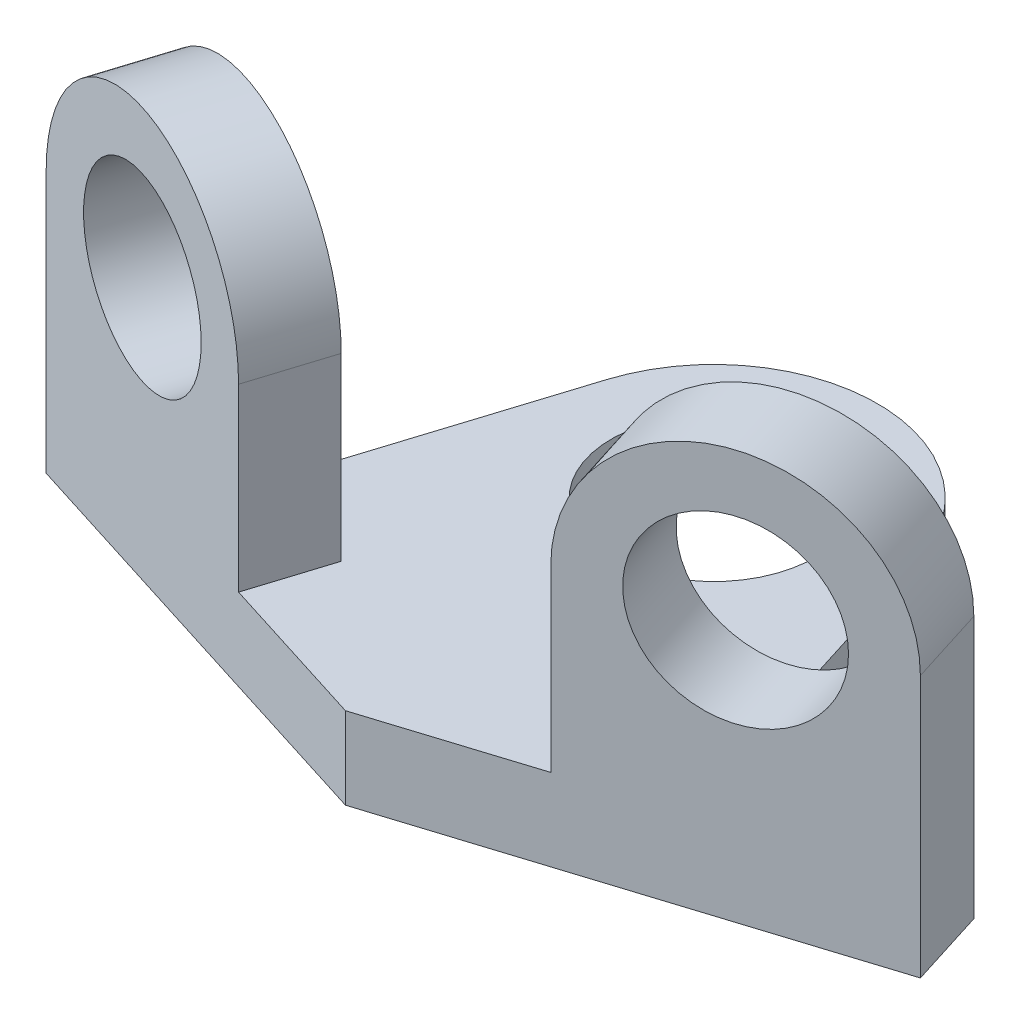
ISO-10303-21;
HEADER;
FILE_DESCRIPTION(('STEP AP214'),'2;1');
FILE_NAME('part.step','',(''),(''),'','','');
FILE_SCHEMA(('AUTOMOTIVE_DESIGN { 1 0 10303 214 1 1 1 1 }'));
ENDSEC;
DATA;
#1=APPLICATION_CONTEXT('core data for automotive mechanical design processes');
#2=APPLICATION_PROTOCOL_DEFINITION('international standard','automotive_design',2000,#1);
#3=PRODUCT_CONTEXT('',#1,'mechanical');
#4=PRODUCT('Part','Part','',(#3));
#5=PRODUCT_RELATED_PRODUCT_CATEGORY('part','',(#4));
#6=PRODUCT_DEFINITION_FORMATION('','',#4);
#7=PRODUCT_DEFINITION_CONTEXT('part definition',#1,'design');
#8=PRODUCT_DEFINITION('design','',#6,#7);
#9=PRODUCT_DEFINITION_SHAPE('','',#8);
#10=(LENGTH_UNIT() NAMED_UNIT(*) SI_UNIT(.MILLI.,.METRE.));
#11=(NAMED_UNIT(*) PLANE_ANGLE_UNIT() SI_UNIT($,.RADIAN.));
#12=(NAMED_UNIT(*) SI_UNIT($,.STERADIAN.) SOLID_ANGLE_UNIT());
#13=UNCERTAINTY_MEASURE_WITH_UNIT(LENGTH_MEASURE(1.E-05),#10,'distance_accuracy_value','');
#14=(GEOMETRIC_REPRESENTATION_CONTEXT(3) GLOBAL_UNCERTAINTY_ASSIGNED_CONTEXT((#13)) GLOBAL_UNIT_ASSIGNED_CONTEXT((#10,
#11,#12)) REPRESENTATION_CONTEXT('',''));
#15=CARTESIAN_POINT('',(0.,0.,0.));
#16=DIRECTION('',(0.,0.,1.));
#17=DIRECTION('',(1.,0.,0.));
#18=AXIS2_PLACEMENT_3D('',#15,#16,#17);
#19=CARTESIAN_POINT('',(31.979808832863,10.,-10.083194993583));
#20=DIRECTION('',(-0.953716950748228,0.,0.300705799504271));
#21=DIRECTION('',(0.300705799504271,0.,0.953716950748228));
#22=AXIS2_PLACEMENT_3D('',#19,#20,#21);
#23=PLANE('',#22);
#24=DIRECTION('',(0.,1.,0.));
#25=VECTOR('',#24,1.);
#26=CARTESIAN_POINT('',(28.9727508378203,10.,-19.6203645010653));
#27=LINE('',#26,#25);
#28=CARTESIAN_POINT('',(28.9727508378203,0.,-19.6203645010653));
#29=VERTEX_POINT('',#28);
#30=CARTESIAN_POINT('',(28.9727508378203,10.,-19.6203645010653));
#31=VERTEX_POINT('',#30);
#32=EDGE_CURVE('E52',#29,#31,#27,.T.);
#33=ORIENTED_EDGE('',*,*,#32,.F.);
#34=DIRECTION('',(-0.300705799504271,0.,-0.953716950748228));
#35=VECTOR('',#34,1.);
#36=CARTESIAN_POINT('',(31.979808832863,0.,-10.083194993583));
#37=LINE('',#36,#35);
#38=CARTESIAN_POINT('',(19.0743390149646,0.,-51.0141159900854));
#39=VERTEX_POINT('',#38);
#40=EDGE_CURVE('E275',#29,#39,#37,.T.);
#41=ORIENTED_EDGE('',*,*,#40,.T.);
#42=DIRECTION('',(0.,-1.,0.));
#43=VECTOR('',#42,1.);
#44=CARTESIAN_POINT('',(19.0743390149646,10.,-51.0141159900854));
#45=LINE('',#44,#43);
#46=CARTESIAN_POINT('',(19.0743390149646,10.,-51.0141159900854));
#47=VERTEX_POINT('',#46);
#48=EDGE_CURVE('E287',#47,#39,#45,.T.);
#49=ORIENTED_EDGE('',*,*,#48,.F.);
#50=DIRECTION('',(-0.300705799504271,0.,-0.953716950748228));
#51=VECTOR('',#50,1.);
#52=CARTESIAN_POINT('',(31.979808832863,10.,-10.083194993583));
#53=LINE('',#52,#51);
#54=EDGE_CURVE('E259',#31,#47,#53,.T.);
#55=ORIENTED_EDGE('',*,*,#54,.F.);
#56=EDGE_LOOP('',(#33,#41,#49,#55));
#57=FACE_BOUND('',#56,.T.);
#58=ADVANCED_FACE('F43',(#57),#23,.F.);
#59=CARTESIAN_POINT('',(0.,10.,-45.));
#60=DIRECTION('',(0.,1.,0.));
#61=DIRECTION('',(0.,0.,1.));
#62=AXIS2_PLACEMENT_3D('',#59,#60,#61);
#63=PLANE('',#62);
#64=DIRECTION('',(0.30070579950427,0.,-0.953716950748228));
#65=VECTOR('',#64,1.);
#66=CARTESIAN_POINT('',(-6.16886919706613,10.,-46.9450369865878));
#67=LINE('',#66,#65);
#68=CARTESIAN_POINT('',(-19.0743390149646,10.,-6.01411599008541));
#69=VERTEX_POINT('',#68);
#70=CARTESIAN_POINT('',(-16.0672810199219,10.,-15.5512854975677));
#71=VERTEX_POINT('',#70);
#72=EDGE_CURVE('E143',#69,#71,#67,.T.);
#73=ORIENTED_EDGE('',*,*,#72,.F.);
#74=DIRECTION('',(0.953716950748228,0.,0.30070579950427));
#75=VECTOR('',#74,1.);
#76=CARTESIAN_POINT('',(-31.979808832863,10.,-10.083194993583));
#77=LINE('',#76,#75);
#78=CARTESIAN_POINT('',(0.,10.,0.));
#79=VERTEX_POINT('',#78);
#80=EDGE_CURVE('E253',#69,#79,#77,.T.);
#81=ORIENTED_EDGE('',*,*,#80,.T.);
#82=DIRECTION('',(0.953716950748228,0.,-0.300705799504271));
#83=VECTOR('',#82,1.);
#84=CARTESIAN_POINT('',(0.,10.,0.));
#85=LINE('',#84,#83);
#86=CARTESIAN_POINT('',(19.0743390149646,10.,-6.01411599008542));
#87=VERTEX_POINT('',#86);
#88=EDGE_CURVE('E64',#79,#87,#85,.T.);
#89=ORIENTED_EDGE('',*,*,#88,.T.);
#90=DIRECTION('',(0.300705799504271,0.,0.953716950748228));
#91=VECTOR('',#90,1.);
#92=CARTESIAN_POINT('',(6.1688691970661,10.,-46.9450369865878));
#93=LINE('',#92,#91);
#94=CARTESIAN_POINT('',(16.0672810199218,10.,-15.5512854975677));
#95=VERTEX_POINT('',#94);
#96=EDGE_CURVE('E59',#95,#87,#93,.T.);
#97=ORIENTED_EDGE('',*,*,#96,.F.);
#98=DIRECTION('',(0.953716950748228,0.,-0.300705799504271));
#99=VECTOR('',#98,1.);
#100=CARTESIAN_POINT('',(9.89841182285574,10.,-13.6062485109799));
#101=LINE('',#100,#99);
#102=EDGE_CURVE('E233',#95,#31,#101,.T.);
#103=ORIENTED_EDGE('',*,*,#102,.T.);
#104=ORIENTED_EDGE('',*,*,#54,.T.);
#105=CARTESIAN_POINT('',(0.,10.,-45.));
#106=DIRECTION('',(0.,1.,0.));
#107=DIRECTION('',(0.,0.,1.));
#108=AXIS2_PLACEMENT_3D('',#105,#106,#107);
#109=CIRCLE('',#108,20.);
#110=CARTESIAN_POINT('',(-19.0743390149646,10.,-51.0141159900854));
#111=VERTEX_POINT('',#110);
#112=EDGE_CURVE('E262',#47,#111,#109,.T.);
#113=ORIENTED_EDGE('',*,*,#112,.T.);
#114=DIRECTION('',(-0.30070579950427,0.,0.953716950748228));
#115=VECTOR('',#114,1.);
#116=CARTESIAN_POINT('',(-19.0743390149646,10.,-51.0141159900854));
#117=LINE('',#116,#115);
#118=CARTESIAN_POINT('',(-28.9727508378203,10.,-19.6203645010653));
#119=VERTEX_POINT('',#118);
#120=EDGE_CURVE('E265',#111,#119,#117,.T.);
#121=ORIENTED_EDGE('',*,*,#120,.T.);
#122=DIRECTION('',(-0.953716950748228,0.,-0.30070579950427));
#123=VECTOR('',#122,1.);
#124=CARTESIAN_POINT('',(-9.89841182285573,10.,-13.6062485109799));
#125=LINE('',#124,#123);
#126=EDGE_CURVE('E187',#71,#119,#125,.T.);
#127=ORIENTED_EDGE('',*,*,#126,.F.);
#128=EDGE_LOOP('',(#73,#81,#89,#97,#103,#104,#113,#121,#127));
#129=FACE_BOUND('',#128,.T.);
#130=CARTESIAN_POINT('',(0.,10.,-45.));
#131=DIRECTION('',(0.,1.,0.));
#132=DIRECTION('',(0.,0.,1.));
#133=AXIS2_PLACEMENT_3D('',#130,#131,#132);
#134=CIRCLE('',#133,12.5);
#135=CARTESIAN_POINT('',(0.,10.,-32.5));
#136=VERTEX_POINT('',#135);
#137=EDGE_CURVE('E245',#136,#136,#134,.T.);
#138=ORIENTED_EDGE('',*,*,#137,.F.);
#139=EDGE_LOOP('',(#138));
#140=FACE_BOUND('',#139,.T.);
#141=ADVANCED_FACE('F320',(#129,#140),#63,.T.);
#142=CARTESIAN_POINT('',(0.,0.,-45.));
#143=DIRECTION('',(0.,1.,0.));
#144=DIRECTION('',(0.,0.,1.));
#145=AXIS2_PLACEMENT_3D('',#142,#143,#144);
#146=PLANE('',#145);
#147=DIRECTION('',(0.953716950748228,0.,-0.300705799504271));
#148=VECTOR('',#147,1.);
#149=CARTESIAN_POINT('',(0.,0.,0.));
#150=LINE('',#149,#148);
#151=CARTESIAN_POINT('',(0.,0.,0.));
#152=VERTEX_POINT('',#151);
#153=CARTESIAN_POINT('',(53.4081492419007,0.,-16.8395247722392));
#154=VERTEX_POINT('',#153);
#155=EDGE_CURVE('E272',#152,#154,#150,.T.);
#156=ORIENTED_EDGE('',*,*,#155,.F.);
#157=DIRECTION('',(0.953716950748228,0.,0.30070579950427));
#158=VECTOR('',#157,1.);
#159=CARTESIAN_POINT('',(-31.979808832863,0.,-10.083194993583));
#160=LINE('',#159,#158);
#161=CARTESIAN_POINT('',(-53.4081492419008,0.,-16.8395247722391));
#162=VERTEX_POINT('',#161);
#163=EDGE_CURVE('E249',#162,#152,#160,.T.);
#164=ORIENTED_EDGE('',*,*,#163,.F.);
#165=DIRECTION('',(-0.30070579950427,0.,0.953716950748228));
#166=VECTOR('',#165,1.);
#167=CARTESIAN_POINT('',(-50.4010912468581,0.,-26.3766942797214));
#168=LINE('',#167,#166);
#169=CARTESIAN_POINT('',(-50.4010912468581,0.,-26.3766942797214));
#170=VERTEX_POINT('',#169);
#171=EDGE_CURVE('E183',#170,#162,#168,.T.);
#172=ORIENTED_EDGE('',*,*,#171,.F.);
#173=DIRECTION('',(0.953716950748228,0.,0.30070579950427));
#174=VECTOR('',#173,1.);
#175=CARTESIAN_POINT('',(-16.0672810199219,0.,-15.5512854975677));
#176=LINE('',#175,#174);
#177=CARTESIAN_POINT('',(-28.9727508378203,0.,-19.6203645010653));
#178=VERTEX_POINT('',#177);
#179=EDGE_CURVE('E158',#170,#178,#176,.T.);
#180=ORIENTED_EDGE('',*,*,#179,.T.);
#181=DIRECTION('',(-0.30070579950427,0.,0.953716950748228));
#182=VECTOR('',#181,1.);
#183=CARTESIAN_POINT('',(-19.0743390149646,0.,-51.0141159900854));
#184=LINE('',#183,#182);
#185=CARTESIAN_POINT('',(-19.0743390149646,0.,-51.0141159900854));
#186=VERTEX_POINT('',#185);
#187=EDGE_CURVE('E256',#186,#178,#184,.T.);
#188=ORIENTED_EDGE('',*,*,#187,.F.);
#189=CARTESIAN_POINT('',(0.,0.,-45.));
#190=DIRECTION('',(0.,1.,0.));
#191=DIRECTION('',(0.,0.,1.));
#192=AXIS2_PLACEMENT_3D('',#189,#190,#191);
#193=CIRCLE('',#192,20.);
#194=EDGE_CURVE('E278',#39,#186,#193,.T.);
#195=ORIENTED_EDGE('',*,*,#194,.F.);
#196=ORIENTED_EDGE('',*,*,#40,.F.);
#197=DIRECTION('',(0.953716950748228,0.,-0.300705799504271));
#198=VECTOR('',#197,1.);
#199=CARTESIAN_POINT('',(16.0672810199218,0.,-15.5512854975677));
#200=LINE('',#199,#198);
#201=CARTESIAN_POINT('',(50.401091246858,0.,-26.3766942797214));
#202=VERTEX_POINT('',#201);
#203=EDGE_CURVE('E207',#29,#202,#200,.T.);
#204=ORIENTED_EDGE('',*,*,#203,.T.);
#205=DIRECTION('',(0.300705799504271,0.,0.953716950748228));
#206=VECTOR('',#205,1.);
#207=CARTESIAN_POINT('',(50.401091246858,0.,-26.3766942797214));
#208=LINE('',#207,#206);
#209=EDGE_CURVE('E219',#202,#154,#208,.T.);
#210=ORIENTED_EDGE('',*,*,#209,.T.);
#211=EDGE_LOOP('',(#156,#164,#172,#180,#188,#195,#196,#204,#210));
#212=FACE_BOUND('',#211,.T.);
#213=CARTESIAN_POINT('',(0.,0.,-45.));
#214=DIRECTION('',(0.,1.,0.));
#215=DIRECTION('',(0.,0.,1.));
#216=AXIS2_PLACEMENT_3D('',#213,#214,#215);
#217=CIRCLE('',#216,12.5);
#218=CARTESIAN_POINT('',(0.,0.,-32.5));
#219=VERTEX_POINT('',#218);
#220=EDGE_CURVE('E244',#219,#219,#217,.T.);
#221=ORIENTED_EDGE('',*,*,#220,.T.);
#222=EDGE_LOOP('',(#221));
#223=FACE_BOUND('',#222,.T.);
#224=ADVANCED_FACE('F309',(#212,#223),#146,.F.);
#225=CARTESIAN_POINT('',(-31.979808832863,10.,-10.083194993583));
#226=DIRECTION('',(0.30070579950427,0.,-0.953716950748228));
#227=DIRECTION('',(-0.953716950748228,0.,-0.30070579950427));
#228=AXIS2_PLACEMENT_3D('',#225,#226,#227);
#229=PLANE('',#228);
#230=ORIENTED_EDGE('',*,*,#80,.F.);
#231=DIRECTION('',(0.,1.,0.));
#232=VECTOR('',#231,1.);
#233=CARTESIAN_POINT('',(-19.0743390149646,32.,-6.01411599008541));
#234=LINE('',#233,#232);
#235=CARTESIAN_POINT('',(-19.0743390149646,32.,-6.01411599008541));
#236=VERTEX_POINT('',#235);
#237=EDGE_CURVE('E174',#69,#236,#234,.T.);
#238=ORIENTED_EDGE('',*,*,#237,.T.);
#239=CARTESIAN_POINT('',(-36.2412441284327,32.,-11.4268203811623));
#240=DIRECTION('',(-0.30070579950427,0.,0.953716950748228));
#241=DIRECTION('',(-0.953716950748228,0.,-0.30070579950427));
#242=AXIS2_PLACEMENT_3D('',#239,#240,#241);
#243=CIRCLE('',#242,18.);
#244=CARTESIAN_POINT('',(-53.4081492419008,32.,-16.8395247722391));
#245=VERTEX_POINT('',#244);
#246=EDGE_CURVE('E155',#236,#245,#243,.T.);
#247=ORIENTED_EDGE('',*,*,#246,.T.);
#248=DIRECTION('',(0.,-1.,0.));
#249=VECTOR('',#248,1.);
#250=CARTESIAN_POINT('',(-53.4081492419008,0.,-16.8395247722391));
#251=LINE('',#250,#249);
#252=EDGE_CURVE('E149',#245,#162,#251,.T.);
#253=ORIENTED_EDGE('',*,*,#252,.T.);
#254=ORIENTED_EDGE('',*,*,#163,.T.);
#255=DIRECTION('',(0.,-1.,0.));
#256=VECTOR('',#255,1.);
#257=CARTESIAN_POINT('',(0.,10.,0.));
#258=LINE('',#257,#256);
#259=EDGE_CURVE('E291',#79,#152,#258,.T.);
#260=ORIENTED_EDGE('',*,*,#259,.F.);
#261=EDGE_LOOP('',(#230,#238,#247,#253,#254,#260));
#262=FACE_BOUND('',#261,.T.);
#263=CARTESIAN_POINT('',(-36.2412441284327,32.,-11.4268203811623));
#264=DIRECTION('',(-0.30070579950427,0.,0.953716950748228));
#265=DIRECTION('',(0.953716950748228,0.,0.30070579950427));
#266=AXIS2_PLACEMENT_3D('',#263,#264,#265);
#267=CIRCLE('',#266,11.);
#268=CARTESIAN_POINT('',(-25.7503576702022,32.,-8.1190565866153));
#269=VERTEX_POINT('',#268);
#270=EDGE_CURVE('E547',#269,#269,#267,.T.);
#271=ORIENTED_EDGE('',*,*,#270,.F.);
#272=EDGE_LOOP('',(#271));
#273=FACE_BOUND('',#272,.T.);
#274=ADVANCED_FACE('F45',(#262,#273),#229,.F.);
#275=CARTESIAN_POINT('',(0.,10.,0.));
#276=DIRECTION('',(-0.300705799504271,0.,-0.953716950748228));
#277=DIRECTION('',(-0.953716950748228,0.,0.300705799504271));
#278=AXIS2_PLACEMENT_3D('',#275,#276,#277);
#279=PLANE('',#278);
#280=ORIENTED_EDGE('',*,*,#155,.T.);
#281=DIRECTION('',(0.,1.,0.));
#282=VECTOR('',#281,1.);
#283=CARTESIAN_POINT('',(53.4081492419007,0.,-16.8395247722392));
#284=LINE('',#283,#282);
#285=CARTESIAN_POINT('',(53.4081492419007,32.,-16.8395247722392));
#286=VERTEX_POINT('',#285);
#287=EDGE_CURVE('E223',#154,#286,#284,.T.);
#288=ORIENTED_EDGE('',*,*,#287,.T.);
#289=CARTESIAN_POINT('',(36.2412441284326,32.,-11.4268203811623));
#290=DIRECTION('',(0.300705799504271,0.,0.953716950748228));
#291=DIRECTION('',(0.953716950748228,0.,-0.300705799504271));
#292=AXIS2_PLACEMENT_3D('',#289,#290,#291);
#293=CIRCLE('',#292,18.);
#294=CARTESIAN_POINT('',(19.0743390149645,32.,-6.01411599008542));
#295=VERTEX_POINT('',#294);
#296=EDGE_CURVE('E208',#286,#295,#293,.T.);
#297=ORIENTED_EDGE('',*,*,#296,.T.);
#298=DIRECTION('',(0.,-1.,0.));
#299=VECTOR('',#298,1.);
#300=CARTESIAN_POINT('',(19.0743390149646,32.,-6.01411599008542));
#301=LINE('',#300,#299);
#302=EDGE_CURVE('E199',#295,#87,#301,.T.);
#303=ORIENTED_EDGE('',*,*,#302,.T.);
#304=ORIENTED_EDGE('',*,*,#88,.F.);
#305=ORIENTED_EDGE('',*,*,#259,.T.);
#306=EDGE_LOOP('',(#280,#288,#297,#303,#304,#305));
#307=FACE_BOUND('',#306,.T.);
#308=CARTESIAN_POINT('',(36.2412441284326,32.,-11.4268203811623));
#309=DIRECTION('',(0.300705799504271,0.,0.953716950748228));
#310=DIRECTION('',(0.953716950748228,0.,-0.300705799504271));
#311=AXIS2_PLACEMENT_3D('',#308,#309,#310);
#312=CIRCLE('',#311,11.);
#313=CARTESIAN_POINT('',(46.7321305866631,32.,-14.7345841757093));
#314=VERTEX_POINT('',#313);
#315=EDGE_CURVE('E194',#314,#314,#312,.T.);
#316=ORIENTED_EDGE('',*,*,#315,.F.);
#317=EDGE_LOOP('',(#316));
#318=FACE_BOUND('',#317,.T.);
#319=ADVANCED_FACE('F330',(#307,#318),#279,.F.);
#320=CARTESIAN_POINT('',(0.,10.,-45.));
#321=DIRECTION('',(0.,-1.,0.));
#322=DIRECTION('',(0.,0.,-1.));
#323=AXIS2_PLACEMENT_3D('',#320,#321,#322);
#324=CYLINDRICAL_SURFACE('',#323,20.);
#325=ORIENTED_EDGE('',*,*,#194,.T.);
#326=DIRECTION('',(0.,-1.,0.));
#327=VECTOR('',#326,1.);
#328=CARTESIAN_POINT('',(-19.0743390149646,10.,-51.0141159900854));
#329=LINE('',#328,#327);
#330=EDGE_CURVE('E269',#111,#186,#329,.T.);
#331=ORIENTED_EDGE('',*,*,#330,.F.);
#332=ORIENTED_EDGE('',*,*,#112,.F.);
#333=ORIENTED_EDGE('',*,*,#48,.T.);
#334=EDGE_LOOP('',(#325,#331,#332,#333));
#335=FACE_BOUND('',#334,.T.);
#336=ADVANCED_FACE('F315',(#335),#324,.T.);
#337=CARTESIAN_POINT('',(-19.0743390149646,10.,-51.0141159900854));
#338=DIRECTION('',(0.953716950748228,0.,0.30070579950427));
#339=DIRECTION('',(0.30070579950427,0.,-0.953716950748228));
#340=AXIS2_PLACEMENT_3D('',#337,#338,#339);
#341=PLANE('',#340);
#342=ORIENTED_EDGE('',*,*,#187,.T.);
#343=DIRECTION('',(0.,1.,0.));
#344=VECTOR('',#343,1.);
#345=CARTESIAN_POINT('',(-28.9727508378203,10.,-19.6203645010653));
#346=LINE('',#345,#344);
#347=EDGE_CURVE('E11',#178,#119,#346,.T.);
#348=ORIENTED_EDGE('',*,*,#347,.T.);
#349=ORIENTED_EDGE('',*,*,#120,.F.);
#350=ORIENTED_EDGE('',*,*,#330,.T.);
#351=EDGE_LOOP('',(#342,#348,#349,#350));
#352=FACE_BOUND('',#351,.T.);
#353=ADVANCED_FACE('F319',(#352),#341,.F.);
#354=CARTESIAN_POINT('',(0.,10.,-45.));
#355=DIRECTION('',(0.,-1.,0.));
#356=DIRECTION('',(0.,0.,-1.));
#357=AXIS2_PLACEMENT_3D('',#354,#355,#356);
#358=CYLINDRICAL_SURFACE('',#357,12.5);
#359=ORIENTED_EDGE('',*,*,#137,.T.);
#360=EDGE_LOOP('',(#359));
#361=FACE_BOUND('',#360,.T.);
#362=ORIENTED_EDGE('',*,*,#220,.F.);
#363=EDGE_LOOP('',(#362));
#364=FACE_BOUND('',#363,.T.);
#365=ADVANCED_FACE('F373',(#361,#364),#358,.F.);
#366=CARTESIAN_POINT('',(16.0672810199218,32.,-15.5512854975677));
#367=DIRECTION('',(-0.953716950748228,0.,0.300705799504271));
#368=DIRECTION('',(0.300705799504271,0.,0.953716950748228));
#369=AXIS2_PLACEMENT_3D('',#366,#367,#368);
#370=PLANE('',#369);
#371=DIRECTION('',(0.,-1.,0.));
#372=VECTOR('',#371,1.);
#373=CARTESIAN_POINT('',(16.0672810199218,32.,-15.5512854975677));
#374=LINE('',#373,#372);
#375=CARTESIAN_POINT('',(16.0672810199218,32.,-15.5512854975677));
#376=VERTEX_POINT('',#375);
#377=EDGE_CURVE('E203',#376,#95,#374,.T.);
#378=ORIENTED_EDGE('',*,*,#377,.T.);
#379=ORIENTED_EDGE('',*,*,#96,.T.);
#380=ORIENTED_EDGE('',*,*,#302,.F.);
#381=DIRECTION('',(0.300705799504271,0.,0.953716950748228));
#382=VECTOR('',#381,1.);
#383=CARTESIAN_POINT('',(16.0672810199218,32.,-15.5512854975677));
#384=LINE('',#383,#382);
#385=EDGE_CURVE('E230',#376,#295,#384,.T.);
#386=ORIENTED_EDGE('',*,*,#385,.F.);
#387=EDGE_LOOP('',(#378,#379,#380,#386));
#388=FACE_BOUND('',#387,.T.);
#389=ADVANCED_FACE('F335',(#388),#370,.T.);
#390=CARTESIAN_POINT('',(33.2341861333899,32.,-20.9639898886446));
#391=DIRECTION('',(0.300705799504271,0.,0.953716950748228));
#392=DIRECTION('',(0.953716950748228,0.,-0.300705799504271));
#393=AXIS2_PLACEMENT_3D('',#390,#391,#392);
#394=CYLINDRICAL_SURFACE('',#393,18.);
#395=ORIENTED_EDGE('',*,*,#296,.F.);
#396=DIRECTION('',(0.300705799504271,0.,0.953716950748228));
#397=VECTOR('',#396,1.);
#398=CARTESIAN_POINT('',(50.401091246858,32.,-26.3766942797214));
#399=LINE('',#398,#397);
#400=CARTESIAN_POINT('',(50.401091246858,32.,-26.3766942797214));
#401=VERTEX_POINT('',#400);
#402=EDGE_CURVE('E234',#401,#286,#399,.T.);
#403=ORIENTED_EDGE('',*,*,#402,.F.);
#404=CARTESIAN_POINT('',(33.2341861333899,32.,-20.9639898886446));
#405=DIRECTION('',(0.300705799504271,0.,0.953716950748228));
#406=DIRECTION('',(0.953716950748228,0.,-0.300705799504271));
#407=AXIS2_PLACEMENT_3D('',#404,#405,#406);
#408=CIRCLE('',#407,18.);
#409=EDGE_CURVE('E215',#401,#376,#408,.T.);
#410=ORIENTED_EDGE('',*,*,#409,.T.);
#411=ORIENTED_EDGE('',*,*,#385,.T.);
#412=EDGE_LOOP('',(#395,#403,#410,#411));
#413=FACE_BOUND('',#412,.T.);
#414=ADVANCED_FACE('F338',(#413),#394,.T.);
#415=CARTESIAN_POINT('',(50.401091246858,0.,-26.3766942797214));
#416=DIRECTION('',(0.953716950748228,0.,-0.300705799504271));
#417=DIRECTION('',(-0.300705799504271,0.,-0.953716950748228));
#418=AXIS2_PLACEMENT_3D('',#415,#416,#417);
#419=PLANE('',#418);
#420=ORIENTED_EDGE('',*,*,#287,.F.);
#421=ORIENTED_EDGE('',*,*,#209,.F.);
#422=DIRECTION('',(0.,1.,0.));
#423=VECTOR('',#422,1.);
#424=CARTESIAN_POINT('',(50.401091246858,0.,-26.3766942797214));
#425=LINE('',#424,#423);
#426=EDGE_CURVE('E211',#202,#401,#425,.T.);
#427=ORIENTED_EDGE('',*,*,#426,.T.);
#428=ORIENTED_EDGE('',*,*,#402,.T.);
#429=EDGE_LOOP('',(#420,#421,#427,#428));
#430=FACE_BOUND('',#429,.T.);
#431=ADVANCED_FACE('F341',(#430),#419,.T.);
#432=CARTESIAN_POINT('',(33.2341861333899,32.,-20.9639898886446));
#433=DIRECTION('',(0.300705799504271,0.,0.953716950748228));
#434=DIRECTION('',(0.953716950748228,0.,-0.300705799504271));
#435=AXIS2_PLACEMENT_3D('',#432,#433,#434);
#436=PLANE('',#435);
#437=ORIENTED_EDGE('',*,*,#102,.F.);
#438=ORIENTED_EDGE('',*,*,#377,.F.);
#439=ORIENTED_EDGE('',*,*,#409,.F.);
#440=ORIENTED_EDGE('',*,*,#426,.F.);
#441=ORIENTED_EDGE('',*,*,#203,.F.);
#442=ORIENTED_EDGE('',*,*,#32,.T.);
#443=EDGE_LOOP('',(#437,#438,#439,#440,#441,#442));
#444=FACE_BOUND('',#443,.T.);
#445=CARTESIAN_POINT('',(33.2341861333899,32.,-20.9639898886446));
#446=DIRECTION('',(0.300705799504271,0.,0.953716950748228));
#447=DIRECTION('',(0.953716950748228,0.,-0.300705799504271));
#448=AXIS2_PLACEMENT_3D('',#445,#446,#447);
#449=CIRCLE('',#448,11.);
#450=CARTESIAN_POINT('',(43.7250725916204,32.,-24.2717536831915));
#451=VERTEX_POINT('',#450);
#452=EDGE_CURVE('E195',#451,#451,#449,.T.);
#453=ORIENTED_EDGE('',*,*,#452,.T.);
#454=EDGE_LOOP('',(#453));
#455=FACE_BOUND('',#454,.T.);
#456=ADVANCED_FACE('F298',(#444,#455),#436,.F.);
#457=CARTESIAN_POINT('',(33.2341861333899,32.,-20.9639898886446));
#458=DIRECTION('',(0.300705799504271,0.,0.953716950748228));
#459=DIRECTION('',(0.953716950748228,0.,-0.300705799504271));
#460=AXIS2_PLACEMENT_3D('',#457,#458,#459);
#461=CYLINDRICAL_SURFACE('',#460,11.);
#462=ORIENTED_EDGE('',*,*,#452,.F.);
#463=EDGE_LOOP('',(#462));
#464=FACE_BOUND('',#463,.T.);
#465=ORIENTED_EDGE('',*,*,#315,.T.);
#466=EDGE_LOOP('',(#465));
#467=FACE_BOUND('',#466,.T.);
#468=ADVANCED_FACE('F348',(#464,#467),#461,.F.);
#469=CARTESIAN_POINT('',(-16.0672810199219,32.,-15.5512854975677));
#470=DIRECTION('',(0.953716950748228,0.,0.30070579950427));
#471=DIRECTION('',(0.30070579950427,0.,-0.953716950748228));
#472=AXIS2_PLACEMENT_3D('',#469,#470,#471);
#473=PLANE('',#472);
#474=ORIENTED_EDGE('',*,*,#237,.F.);
#475=ORIENTED_EDGE('',*,*,#72,.T.);
#476=DIRECTION('',(0.,1.,0.));
#477=VECTOR('',#476,1.);
#478=CARTESIAN_POINT('',(-16.0672810199219,32.,-15.5512854975677));
#479=LINE('',#478,#477);
#480=CARTESIAN_POINT('',(-16.0672810199219,32.,-15.5512854975677));
#481=VERTEX_POINT('',#480);
#482=EDGE_CURVE('E137',#71,#481,#479,.T.);
#483=ORIENTED_EDGE('',*,*,#482,.T.);
#484=DIRECTION('',(-0.30070579950427,0.,0.953716950748228));
#485=VECTOR('',#484,1.);
#486=CARTESIAN_POINT('',(-16.0672810199219,32.,-15.5512854975677));
#487=LINE('',#486,#485);
#488=EDGE_CURVE('E140',#481,#236,#487,.T.);
#489=ORIENTED_EDGE('',*,*,#488,.T.);
#490=EDGE_LOOP('',(#474,#475,#483,#489));
#491=FACE_BOUND('',#490,.T.);
#492=ADVANCED_FACE('F139',(#491),#473,.T.);
#493=CARTESIAN_POINT('',(-50.4010912468581,0.,-26.3766942797214));
#494=DIRECTION('',(-0.953716950748228,0.,-0.30070579950427));
#495=DIRECTION('',(-0.30070579950427,0.,0.953716950748228));
#496=AXIS2_PLACEMENT_3D('',#493,#494,#495);
#497=PLANE('',#496);
#498=ORIENTED_EDGE('',*,*,#252,.F.);
#499=DIRECTION('',(-0.30070579950427,0.,0.953716950748228));
#500=VECTOR('',#499,1.);
#501=CARTESIAN_POINT('',(-50.4010912468581,32.,-26.3766942797214));
#502=LINE('',#501,#500);
#503=CARTESIAN_POINT('',(-50.4010912468581,32.,-26.3766942797214));
#504=VERTEX_POINT('',#503);
#505=EDGE_CURVE('E157',#504,#245,#502,.T.);
#506=ORIENTED_EDGE('',*,*,#505,.F.);
#507=DIRECTION('',(0.,-1.,0.));
#508=VECTOR('',#507,1.);
#509=CARTESIAN_POINT('',(-50.4010912468581,0.,-26.3766942797214));
#510=LINE('',#509,#508);
#511=EDGE_CURVE('E164',#504,#170,#510,.T.);
#512=ORIENTED_EDGE('',*,*,#511,.T.);
#513=ORIENTED_EDGE('',*,*,#171,.T.);
#514=EDGE_LOOP('',(#498,#506,#512,#513));
#515=FACE_BOUND('',#514,.T.);
#516=ADVANCED_FACE('F325',(#515),#497,.T.);
#517=CARTESIAN_POINT('',(-33.23418613339,32.,-20.9639898886446));
#518=DIRECTION('',(-0.30070579950427,0.,0.953716950748228));
#519=DIRECTION('',(0.953716950748228,0.,0.30070579950427));
#520=AXIS2_PLACEMENT_3D('',#517,#518,#519);
#521=CYLINDRICAL_SURFACE('',#520,18.);
#522=ORIENTED_EDGE('',*,*,#246,.F.);
#523=ORIENTED_EDGE('',*,*,#488,.F.);
#524=CARTESIAN_POINT('',(-33.23418613339,32.,-20.9639898886446));
#525=DIRECTION('',(-0.30070579950427,0.,0.953716950748228));
#526=DIRECTION('',(-0.953716950748228,0.,-0.30070579950427));
#527=AXIS2_PLACEMENT_3D('',#524,#525,#526);
#528=CIRCLE('',#527,18.);
#529=EDGE_CURVE('E148',#481,#504,#528,.T.);
#530=ORIENTED_EDGE('',*,*,#529,.T.);
#531=ORIENTED_EDGE('',*,*,#505,.T.);
#532=EDGE_LOOP('',(#522,#523,#530,#531));
#533=FACE_BOUND('',#532,.T.);
#534=ADVANCED_FACE('F153',(#533),#521,.T.);
#535=CARTESIAN_POINT('',(-33.23418613339,32.,-20.9639898886446));
#536=DIRECTION('',(0.30070579950427,0.,-0.953716950748228));
#537=DIRECTION('',(-0.953716950748228,0.,-0.30070579950427));
#538=AXIS2_PLACEMENT_3D('',#535,#536,#537);
#539=PLANE('',#538);
#540=CARTESIAN_POINT('',(-33.23418613339,32.,-20.9639898886446));
#541=DIRECTION('',(-0.30070579950427,0.,0.953716950748228));
#542=DIRECTION('',(0.953716950748228,0.,0.30070579950427));
#543=AXIS2_PLACEMENT_3D('',#540,#541,#542);
#544=CIRCLE('',#543,11.);
#545=CARTESIAN_POINT('',(-22.7432996751595,32.,-17.6562260940976));
#546=VERTEX_POINT('',#545);
#547=EDGE_CURVE('E177',#546,#546,#544,.T.);
#548=ORIENTED_EDGE('',*,*,#547,.T.);
#549=EDGE_LOOP('',(#548));
#550=FACE_BOUND('',#549,.T.);
#551=ORIENTED_EDGE('',*,*,#482,.F.);
#552=ORIENTED_EDGE('',*,*,#126,.T.);
#553=ORIENTED_EDGE('',*,*,#347,.F.);
#554=ORIENTED_EDGE('',*,*,#179,.F.);
#555=ORIENTED_EDGE('',*,*,#511,.F.);
#556=ORIENTED_EDGE('',*,*,#529,.F.);
#557=EDGE_LOOP('',(#551,#552,#553,#554,#555,#556));
#558=FACE_BOUND('',#557,.T.);
#559=ADVANCED_FACE('F161',(#550,#558),#539,.T.);
#560=CARTESIAN_POINT('',(-33.23418613339,32.,-20.9639898886446));
#561=DIRECTION('',(-0.30070579950427,0.,0.953716950748228));
#562=DIRECTION('',(0.953716950748228,0.,0.30070579950427));
#563=AXIS2_PLACEMENT_3D('',#560,#561,#562);
#564=CYLINDRICAL_SURFACE('',#563,11.);
#565=ORIENTED_EDGE('',*,*,#547,.F.);
#566=EDGE_LOOP('',(#565));
#567=FACE_BOUND('',#566,.T.);
#568=ORIENTED_EDGE('',*,*,#270,.T.);
#569=EDGE_LOOP('',(#568));
#570=FACE_BOUND('',#569,.T.);
#571=ADVANCED_FACE('F474',(#567,#570),#564,.F.);
#572=CLOSED_SHELL('',(#58,#141,#224,#274,#319,#336,#353,#365,#389,#414,#431,#456,#468,#492,#516,
#534,#559,#571));
#573=MANIFOLD_SOLID_BREP('B2',#572);
#574=ADVANCED_BREP_SHAPE_REPRESENTATION('',(#18,#573),#14);
#575=SHAPE_DEFINITION_REPRESENTATION(#9,#574);
ENDSEC;
END-ISO-10303-21;
